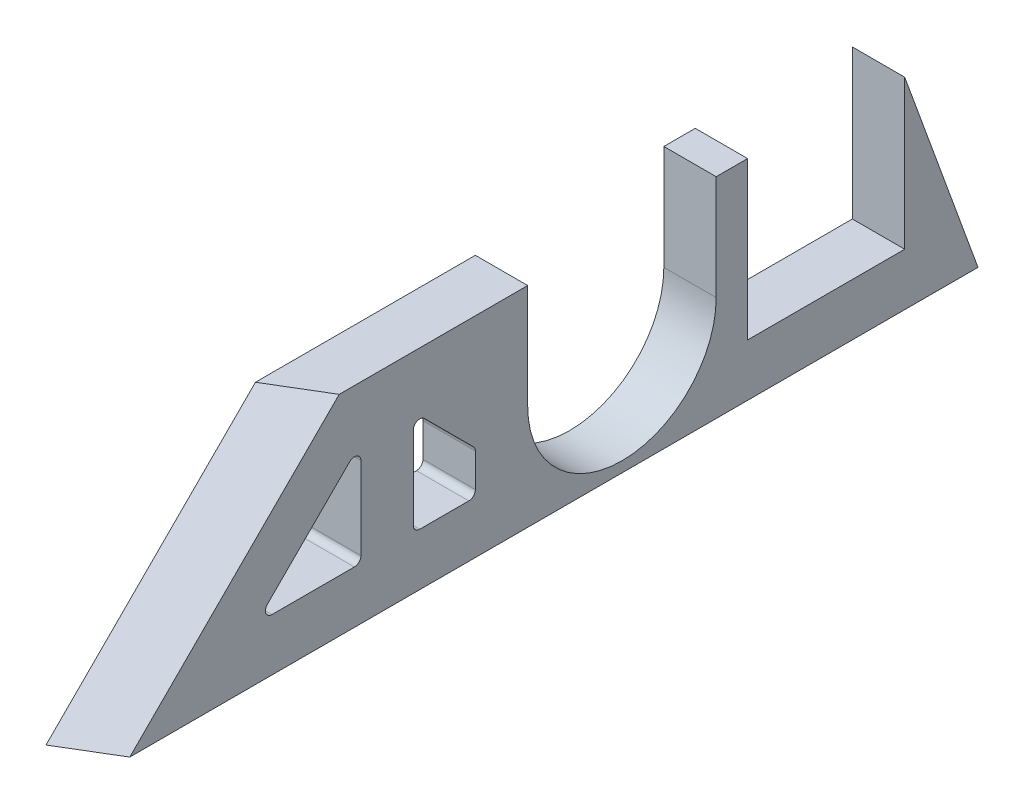
ISO-10303-21;
HEADER;
FILE_DESCRIPTION(('STEP AP214'),'2;1');
FILE_NAME('part.step','',(''),(''),'','','');
FILE_SCHEMA(('AUTOMOTIVE_DESIGN { 1 0 10303 214 1 1 1 1 }'));
ENDSEC;
DATA;
#1=APPLICATION_CONTEXT('core data for automotive mechanical design processes');
#2=APPLICATION_PROTOCOL_DEFINITION('international standard','automotive_design',2000,#1);
#3=PRODUCT_CONTEXT('',#1,'mechanical');
#4=PRODUCT('Part','Part','',(#3));
#5=PRODUCT_RELATED_PRODUCT_CATEGORY('part','',(#4));
#6=PRODUCT_DEFINITION_FORMATION('','',#4);
#7=PRODUCT_DEFINITION_CONTEXT('part definition',#1,'design');
#8=PRODUCT_DEFINITION('design','',#6,#7);
#9=PRODUCT_DEFINITION_SHAPE('','',#8);
#10=(LENGTH_UNIT() NAMED_UNIT(*) SI_UNIT(.MILLI.,.METRE.));
#11=(NAMED_UNIT(*) PLANE_ANGLE_UNIT() SI_UNIT($,.RADIAN.));
#12=(NAMED_UNIT(*) SI_UNIT($,.STERADIAN.) SOLID_ANGLE_UNIT());
#13=UNCERTAINTY_MEASURE_WITH_UNIT(LENGTH_MEASURE(1.E-05),#10,'distance_accuracy_value','');
#14=(GEOMETRIC_REPRESENTATION_CONTEXT(3) GLOBAL_UNCERTAINTY_ASSIGNED_CONTEXT((#13)) GLOBAL_UNIT_ASSIGNED_CONTEXT((#10,
#11,#12)) REPRESENTATION_CONTEXT('',''));
#15=CARTESIAN_POINT('',(0.,0.,0.));
#16=DIRECTION('',(0.,0.,1.));
#17=DIRECTION('',(1.,0.,0.));
#18=AXIS2_PLACEMENT_3D('',#15,#16,#17);
#19=CARTESIAN_POINT('',(12.7,0.,0.));
#20=DIRECTION('',(1.,0.,0.));
#21=DIRECTION('',(0.,0.,-1.));
#22=AXIS2_PLACEMENT_3D('',#19,#20,#21);
#23=PLANE('',#22);
#24=DIRECTION('',(0.,-0.707106781186544,0.707106781186551));
#25=VECTOR('',#24,1.);
#26=CARTESIAN_POINT('',(12.7,128.271,-29.2110000000011));
#27=LINE('',#26,#25);
#28=CARTESIAN_POINT('',(12.7,50.8,48.2599999999995));
#29=VERTEX_POINT('',#28);
#30=CARTESIAN_POINT('',(12.7,0.,99.06));
#31=VERTEX_POINT('',#30);
#32=EDGE_CURVE('E199',#29,#31,#27,.T.);
#33=ORIENTED_EDGE('',*,*,#32,.T.);
#34=DIRECTION('',(0.,0.,-1.));
#35=VECTOR('',#34,1.);
#36=CARTESIAN_POINT('',(12.7,0.,0.));
#37=LINE('',#36,#35);
#38=CARTESIAN_POINT('',(12.7,0.,-106.68));
#39=VERTEX_POINT('',#38);
#40=EDGE_CURVE('E225',#31,#39,#37,.T.);
#41=ORIENTED_EDGE('',*,*,#40,.T.);
#42=DIRECTION('',(0.,0.939692620785907,0.342020143325673));
#43=VECTOR('',#42,1.);
#44=CARTESIAN_POINT('',(12.7,34.2862911006804,-94.200810595966));
#45=LINE('',#44,#43);
#46=CARTESIAN_POINT('',(12.7,48.8501485179025,-88.9));
#47=VERTEX_POINT('',#46);
#48=EDGE_CURVE('E228',#39,#47,#45,.T.);
#49=ORIENTED_EDGE('',*,*,#48,.T.);
#50=DIRECTION('',(0.,-1.,0.));
#51=VECTOR('',#50,1.);
#52=CARTESIAN_POINT('',(12.7,0.,-88.9));
#53=LINE('',#52,#51);
#54=CARTESIAN_POINT('',(12.7,12.7,-88.9));
#55=VERTEX_POINT('',#54);
#56=EDGE_CURVE('E244',#47,#55,#53,.T.);
#57=ORIENTED_EDGE('',*,*,#56,.T.);
#58=DIRECTION('',(0.,0.,1.));
#59=VECTOR('',#58,1.);
#60=CARTESIAN_POINT('',(12.7,12.7,0.));
#61=LINE('',#60,#59);
#62=CARTESIAN_POINT('',(12.7,12.7,-50.8));
#63=VERTEX_POINT('',#62);
#64=EDGE_CURVE('E240',#55,#63,#61,.T.);
#65=ORIENTED_EDGE('',*,*,#64,.T.);
#66=DIRECTION('',(0.,1.,0.));
#67=VECTOR('',#66,1.);
#68=CARTESIAN_POINT('',(12.7,0.,-50.8));
#69=LINE('',#68,#67);
#70=CARTESIAN_POINT('',(12.7,50.8,-50.8));
#71=VERTEX_POINT('',#70);
#72=EDGE_CURVE('E233',#63,#71,#69,.T.);
#73=ORIENTED_EDGE('',*,*,#72,.T.);
#74=DIRECTION('',(0.,0.,1.));
#75=VECTOR('',#74,1.);
#76=CARTESIAN_POINT('',(12.7,50.8,0.));
#77=LINE('',#76,#75);
#78=CARTESIAN_POINT('',(12.7,50.8,-43.18));
#79=VERTEX_POINT('',#78);
#80=EDGE_CURVE('E227',#71,#79,#77,.T.);
#81=ORIENTED_EDGE('',*,*,#80,.T.);
#82=DIRECTION('',(0.,1.,0.));
#83=VECTOR('',#82,1.);
#84=CARTESIAN_POINT('',(12.7,0.,-43.18));
#85=LINE('',#84,#83);
#86=CARTESIAN_POINT('',(12.7,25.4,-43.18));
#87=VERTEX_POINT('',#86);
#88=EDGE_CURVE('E232',#87,#79,#85,.T.);
#89=ORIENTED_EDGE('',*,*,#88,.F.);
#90=CARTESIAN_POINT('',(12.7,25.4,-20.32));
#91=DIRECTION('',(1.,0.,0.));
#92=DIRECTION('',(0.,0.,-1.));
#93=AXIS2_PLACEMENT_3D('',#90,#91,#92);
#94=CIRCLE('',#93,22.86);
#95=CARTESIAN_POINT('',(12.7,25.4,2.54));
#96=VERTEX_POINT('',#95);
#97=EDGE_CURVE('E230',#96,#87,#94,.T.);
#98=ORIENTED_EDGE('',*,*,#97,.F.);
#99=DIRECTION('',(0.,1.,0.));
#100=VECTOR('',#99,1.);
#101=CARTESIAN_POINT('',(12.7,0.,2.54));
#102=LINE('',#101,#100);
#103=CARTESIAN_POINT('',(12.7,50.8,2.54));
#104=VERTEX_POINT('',#103);
#105=EDGE_CURVE('E223',#96,#104,#102,.T.);
#106=ORIENTED_EDGE('',*,*,#105,.T.);
#107=EDGE_CURVE('E215',#104,#29,#77,.T.);
#108=ORIENTED_EDGE('',*,*,#107,.T.);
#109=EDGE_LOOP('',(#33,#41,#49,#57,#65,#73,#81,#89,#98,#106,#108));
#110=FACE_BOUND('',#109,.T.);
#111=DIRECTION('',(0.,0.707106781186547,0.707106781186548));
#112=VECTOR('',#111,1.);
#113=CARTESIAN_POINT('',(12.7,3.90025612106941,-3.90025612106941));
#114=LINE('',#113,#112);
#115=CARTESIAN_POINT('',(12.7,23.5054802270052,15.7049679848664));
#116=VERTEX_POINT('',#115);
#117=CARTESIAN_POINT('',(12.7,35.3899679848664,27.5894557427275));
#118=VERTEX_POINT('',#117);
#119=EDGE_CURVE('E351',#116,#118,#114,.T.);
#120=ORIENTED_EDGE('',*,*,#119,.F.);
#121=CARTESIAN_POINT('',(12.7,22.3829482118715,16.8275));
#122=DIRECTION('',(1.,0.,0.));
#123=DIRECTION('',(0.,0.,-1.));
#124=AXIS2_PLACEMENT_3D('',#121,#122,#123);
#125=CIRCLE('',#124,1.5875);
#126=CARTESIAN_POINT('',(12.7,22.3829482118715,15.24));
#127=VERTEX_POINT('',#126);
#128=EDGE_CURVE('E41',#116,#127,#125,.F.);
#129=ORIENTED_EDGE('',*,*,#128,.T.);
#130=DIRECTION('',(0.,-1.,0.));
#131=VECTOR('',#130,1.);
#132=CARTESIAN_POINT('',(12.7,0.,15.24));
#133=LINE('',#132,#131);
#134=CARTESIAN_POINT('',(12.7,14.2875,15.24));
#135=VERTEX_POINT('',#134);
#136=EDGE_CURVE('E350',#127,#135,#133,.T.);
#137=ORIENTED_EDGE('',*,*,#136,.T.);
#138=CARTESIAN_POINT('',(12.7,14.2875,16.8275));
#139=DIRECTION('',(1.,0.,0.));
#140=DIRECTION('',(0.,0.,-1.));
#141=AXIS2_PLACEMENT_3D('',#138,#139,#140);
#142=CIRCLE('',#141,1.5875);
#143=CARTESIAN_POINT('',(12.7,12.7,16.8275));
#144=VERTEX_POINT('',#143);
#145=EDGE_CURVE('E337',#135,#144,#142,.F.);
#146=ORIENTED_EDGE('',*,*,#145,.T.);
#147=DIRECTION('',(0.,0.,-1.));
#148=VECTOR('',#147,1.);
#149=CARTESIAN_POINT('',(12.7,12.7,0.));
#150=LINE('',#149,#148);
#151=CARTESIAN_POINT('',(12.7,12.7,28.7119877578612));
#152=VERTEX_POINT('',#151);
#153=EDGE_CURVE('E372',#152,#144,#150,.T.);
#154=ORIENTED_EDGE('',*,*,#153,.F.);
#155=CARTESIAN_POINT('',(12.7,14.2875,28.7119877578612));
#156=DIRECTION('',(1.,0.,0.));
#157=DIRECTION('',(0.,0.,-1.));
#158=AXIS2_PLACEMENT_3D('',#155,#156,#157);
#159=CIRCLE('',#158,1.5875);
#160=CARTESIAN_POINT('',(12.7,14.2875,30.2994877578612));
#161=VERTEX_POINT('',#160);
#162=EDGE_CURVE('E329',#152,#161,#159,.F.);
#163=ORIENTED_EDGE('',*,*,#162,.T.);
#164=DIRECTION('',(0.,-1.,0.));
#165=VECTOR('',#164,1.);
#166=CARTESIAN_POINT('',(12.7,0.,30.2994877578612));
#167=LINE('',#166,#165);
#168=CARTESIAN_POINT('',(12.7,34.2674359697327,30.2994877578612));
#169=VERTEX_POINT('',#168);
#170=EDGE_CURVE('E378',#169,#161,#167,.T.);
#171=ORIENTED_EDGE('',*,*,#170,.F.);
#172=CARTESIAN_POINT('',(12.7,34.2674359697327,28.7119877578612));
#173=DIRECTION('',(1.,0.,0.));
#174=DIRECTION('',(0.,0.,-1.));
#175=AXIS2_PLACEMENT_3D('',#172,#173,#174);
#176=CIRCLE('',#175,1.5875);
#177=EDGE_CURVE('E48',#169,#118,#176,.F.);
#178=ORIENTED_EDGE('',*,*,#177,.T.);
#179=EDGE_LOOP('',(#120,#129,#137,#146,#154,#163,#171,#178));
#180=FACE_BOUND('',#179,.T.);
#181=DIRECTION('',(0.,0.707106781186547,-0.707106781186548));
#182=VECTOR('',#181,1.);
#183=CARTESIAN_POINT('',(12.7,40.5497438789306,40.5497438789306));
#184=LINE('',#183,#182);
#185=CARTESIAN_POINT('',(12.7,15.4100320151336,65.6894557427275));
#186=VERTEX_POINT('',#185);
#187=CARTESIAN_POINT('',(12.7,35.3899679848664,45.7095197729948));
#188=VERTEX_POINT('',#187);
#189=EDGE_CURVE('E676',#186,#188,#184,.T.);
#190=ORIENTED_EDGE('',*,*,#189,.T.);
#191=CARTESIAN_POINT('',(12.7,34.2674359697327,44.5869877578612));
#192=DIRECTION('',(1.,0.,0.));
#193=DIRECTION('',(0.,0.,-1.));
#194=AXIS2_PLACEMENT_3D('',#191,#192,#193);
#195=CIRCLE('',#194,1.5875);
#196=CARTESIAN_POINT('',(12.7,34.2674359697327,42.9994877578612));
#197=VERTEX_POINT('',#196);
#198=EDGE_CURVE('E341',#188,#197,#195,.F.);
#199=ORIENTED_EDGE('',*,*,#198,.T.);
#200=DIRECTION('',(0.,-1.,0.));
#201=VECTOR('',#200,1.);
#202=CARTESIAN_POINT('',(12.7,0.,42.9994877578612));
#203=LINE('',#202,#201);
#204=CARTESIAN_POINT('',(12.7,14.2875,42.9994877578612));
#205=VERTEX_POINT('',#204);
#206=EDGE_CURVE('E679',#197,#205,#203,.T.);
#207=ORIENTED_EDGE('',*,*,#206,.T.);
#208=CARTESIAN_POINT('',(12.7,14.2875,44.5869877578612));
#209=DIRECTION('',(1.,0.,0.));
#210=DIRECTION('',(0.,0.,-1.));
#211=AXIS2_PLACEMENT_3D('',#208,#209,#210);
#212=CIRCLE('',#211,1.5875);
#213=CARTESIAN_POINT('',(12.7,12.7,44.5869877578612));
#214=VERTEX_POINT('',#213);
#215=EDGE_CURVE('E333',#205,#214,#212,.F.);
#216=ORIENTED_EDGE('',*,*,#215,.T.);
#217=DIRECTION('',(0.,0.,1.));
#218=VECTOR('',#217,1.);
#219=CARTESIAN_POINT('',(12.7,12.7,0.));
#220=LINE('',#219,#218);
#221=CARTESIAN_POINT('',(12.7,12.7,64.5669237275939));
#222=VERTEX_POINT('',#221);
#223=EDGE_CURVE('E682',#214,#222,#220,.T.);
#224=ORIENTED_EDGE('',*,*,#223,.T.);
#225=CARTESIAN_POINT('',(12.7,14.2875,64.5669237275939));
#226=DIRECTION('',(1.,0.,0.));
#227=DIRECTION('',(0.,0.,-1.));
#228=AXIS2_PLACEMENT_3D('',#225,#226,#227);
#229=CIRCLE('',#228,1.5875);
#230=EDGE_CURVE('E325',#222,#186,#229,.F.);
#231=ORIENTED_EDGE('',*,*,#230,.T.);
#232=EDGE_LOOP('',(#190,#199,#207,#216,#224,#231));
#233=FACE_BOUND('',#232,.T.);
#234=ADVANCED_FACE('F33',(#110,#180,#233),#23,.T.);
#235=CARTESIAN_POINT('',(0.,0.,0.));
#236=DIRECTION('',(1.,0.,0.));
#237=DIRECTION('',(0.,0.,-1.));
#238=AXIS2_PLACEMENT_3D('',#235,#236,#237);
#239=PLANE('',#238);
#240=DIRECTION('',(0.,0.,1.));
#241=VECTOR('',#240,1.);
#242=CARTESIAN_POINT('',(0.,12.7,0.));
#243=LINE('',#242,#241);
#244=CARTESIAN_POINT('',(0.,12.7,16.8275));
#245=VERTEX_POINT('',#244);
#246=CARTESIAN_POINT('',(0.,12.7,28.7119877578612));
#247=VERTEX_POINT('',#246);
#248=EDGE_CURVE('E663',#245,#247,#243,.T.);
#249=ORIENTED_EDGE('',*,*,#248,.F.);
#250=CARTESIAN_POINT('',(0.,14.2875,16.8275));
#251=DIRECTION('',(1.,0.,0.));
#252=DIRECTION('',(0.,0.,-1.));
#253=AXIS2_PLACEMENT_3D('',#250,#251,#252);
#254=CIRCLE('',#253,1.5875);
#255=CARTESIAN_POINT('',(0.,14.2875,15.24));
#256=VERTEX_POINT('',#255);
#257=EDGE_CURVE('E339',#245,#256,#254,.T.);
#258=ORIENTED_EDGE('',*,*,#257,.T.);
#259=DIRECTION('',(0.,1.,0.));
#260=VECTOR('',#259,1.);
#261=CARTESIAN_POINT('',(0.,0.,15.24));
#262=LINE('',#261,#260);
#263=CARTESIAN_POINT('',(0.,22.3829482118715,15.24));
#264=VERTEX_POINT('',#263);
#265=EDGE_CURVE('E357',#256,#264,#262,.T.);
#266=ORIENTED_EDGE('',*,*,#265,.T.);
#267=CARTESIAN_POINT('',(0.,22.3829482118715,16.8275));
#268=DIRECTION('',(1.,0.,0.));
#269=DIRECTION('',(0.,0.,-1.));
#270=AXIS2_PLACEMENT_3D('',#267,#268,#269);
#271=CIRCLE('',#270,1.5875);
#272=CARTESIAN_POINT('',(0.,23.5054802270052,15.7049679848663));
#273=VERTEX_POINT('',#272);
#274=EDGE_CURVE('E11',#264,#273,#271,.T.);
#275=ORIENTED_EDGE('',*,*,#274,.T.);
#276=DIRECTION('',(0.,-0.707106781186547,-0.707106781186548));
#277=VECTOR('',#276,1.);
#278=CARTESIAN_POINT('',(0.,3.90025612106941,-3.90025612106941));
#279=LINE('',#278,#277);
#280=CARTESIAN_POINT('',(0.,35.3899679848664,27.5894557427275));
#281=VERTEX_POINT('',#280);
#282=EDGE_CURVE('E366',#281,#273,#279,.T.);
#283=ORIENTED_EDGE('',*,*,#282,.F.);
#284=CARTESIAN_POINT('',(0.,34.2674359697327,28.7119877578612));
#285=DIRECTION('',(1.,0.,0.));
#286=DIRECTION('',(0.,0.,-1.));
#287=AXIS2_PLACEMENT_3D('',#284,#285,#286);
#288=CIRCLE('',#287,1.5875);
#289=CARTESIAN_POINT('',(0.,34.2674359697327,30.2994877578612));
#290=VERTEX_POINT('',#289);
#291=EDGE_CURVE('E346',#281,#290,#288,.T.);
#292=ORIENTED_EDGE('',*,*,#291,.T.);
#293=DIRECTION('',(0.,1.,0.));
#294=VECTOR('',#293,1.);
#295=CARTESIAN_POINT('',(0.,0.,30.2994877578612));
#296=LINE('',#295,#294);
#297=CARTESIAN_POINT('',(0.,14.2875,30.2994877578612));
#298=VERTEX_POINT('',#297);
#299=EDGE_CURVE('E659',#298,#290,#296,.T.);
#300=ORIENTED_EDGE('',*,*,#299,.F.);
#301=CARTESIAN_POINT('',(0.,14.2875,28.7119877578612));
#302=DIRECTION('',(1.,0.,0.));
#303=DIRECTION('',(0.,0.,-1.));
#304=AXIS2_PLACEMENT_3D('',#301,#302,#303);
#305=CIRCLE('',#304,1.5875);
#306=EDGE_CURVE('E331',#298,#247,#305,.T.);
#307=ORIENTED_EDGE('',*,*,#306,.T.);
#308=EDGE_LOOP('',(#249,#258,#266,#275,#283,#292,#300,#307));
#309=FACE_BOUND('',#308,.T.);
#310=CARTESIAN_POINT('',(0.,25.4,-20.32));
#311=DIRECTION('',(1.,0.,0.));
#312=DIRECTION('',(0.,0.,-1.));
#313=AXIS2_PLACEMENT_3D('',#310,#311,#312);
#314=CIRCLE('',#313,22.86);
#315=CARTESIAN_POINT('',(0.,25.4,2.54));
#316=VERTEX_POINT('',#315);
#317=CARTESIAN_POINT('',(0.,25.4,-43.18));
#318=VERTEX_POINT('',#317);
#319=EDGE_CURVE('E209',#316,#318,#314,.T.);
#320=ORIENTED_EDGE('',*,*,#319,.T.);
#321=DIRECTION('',(0.,1.,0.));
#322=VECTOR('',#321,1.);
#323=CARTESIAN_POINT('',(0.,0.,-43.18));
#324=LINE('',#323,#322);
#325=CARTESIAN_POINT('',(0.,50.8,-43.18));
#326=VERTEX_POINT('',#325);
#327=EDGE_CURVE('E266',#318,#326,#324,.T.);
#328=ORIENTED_EDGE('',*,*,#327,.T.);
#329=DIRECTION('',(0.,0.,1.));
#330=VECTOR('',#329,1.);
#331=CARTESIAN_POINT('',(0.,50.8,0.));
#332=LINE('',#331,#330);
#333=CARTESIAN_POINT('',(0.,50.8,-50.8));
#334=VERTEX_POINT('',#333);
#335=EDGE_CURVE('E254',#334,#326,#332,.T.);
#336=ORIENTED_EDGE('',*,*,#335,.F.);
#337=DIRECTION('',(0.,1.,0.));
#338=VECTOR('',#337,1.);
#339=CARTESIAN_POINT('',(0.,0.,-50.8));
#340=LINE('',#339,#338);
#341=CARTESIAN_POINT('',(0.,12.7,-50.8));
#342=VERTEX_POINT('',#341);
#343=EDGE_CURVE('E264',#342,#334,#340,.T.);
#344=ORIENTED_EDGE('',*,*,#343,.F.);
#345=DIRECTION('',(0.,0.,1.));
#346=VECTOR('',#345,1.);
#347=CARTESIAN_POINT('',(0.,12.7,0.));
#348=LINE('',#347,#346);
#349=CARTESIAN_POINT('',(0.,12.7,-88.9));
#350=VERTEX_POINT('',#349);
#351=EDGE_CURVE('E262',#350,#342,#348,.T.);
#352=ORIENTED_EDGE('',*,*,#351,.F.);
#353=DIRECTION('',(0.,-1.,0.));
#354=VECTOR('',#353,1.);
#355=CARTESIAN_POINT('',(0.,0.,-88.9));
#356=LINE('',#355,#354);
#357=CARTESIAN_POINT('',(0.,48.8501485179025,-88.9));
#358=VERTEX_POINT('',#357);
#359=EDGE_CURVE('E260',#358,#350,#356,.T.);
#360=ORIENTED_EDGE('',*,*,#359,.F.);
#361=DIRECTION('',(0.,0.939692620785907,0.342020143325673));
#362=VECTOR('',#361,1.);
#363=CARTESIAN_POINT('',(0.,34.2862911006804,-94.200810595966));
#364=LINE('',#363,#362);
#365=CARTESIAN_POINT('',(0.,0.,-106.68));
#366=VERTEX_POINT('',#365);
#367=EDGE_CURVE('E258',#366,#358,#364,.T.);
#368=ORIENTED_EDGE('',*,*,#367,.F.);
#369=DIRECTION('',(0.,0.,-1.));
#370=VECTOR('',#369,1.);
#371=CARTESIAN_POINT('',(0.,0.,0.));
#372=LINE('',#371,#370);
#373=CARTESIAN_POINT('',(0.,0.,106.68));
#374=VERTEX_POINT('',#373);
#375=EDGE_CURVE('E256',#374,#366,#372,.T.);
#376=ORIENTED_EDGE('',*,*,#375,.F.);
#377=DIRECTION('',(0.,-0.707106781186544,0.707106781186551));
#378=VECTOR('',#377,1.);
#379=CARTESIAN_POINT('',(0.,53.34,53.3399999999994));
#380=LINE('',#379,#378);
#381=CARTESIAN_POINT('',(0.,50.8,55.8799999999995));
#382=VERTEX_POINT('',#381);
#383=EDGE_CURVE('E253',#382,#374,#380,.T.);
#384=ORIENTED_EDGE('',*,*,#383,.F.);
#385=CARTESIAN_POINT('',(0.,50.8,2.54));
#386=VERTEX_POINT('',#385);
#387=EDGE_CURVE('E217',#386,#382,#332,.T.);
#388=ORIENTED_EDGE('',*,*,#387,.F.);
#389=DIRECTION('',(0.,1.,0.));
#390=VECTOR('',#389,1.);
#391=CARTESIAN_POINT('',(0.,0.,2.54));
#392=LINE('',#391,#390);
#393=EDGE_CURVE('E250',#316,#386,#392,.T.);
#394=ORIENTED_EDGE('',*,*,#393,.F.);
#395=EDGE_LOOP('',(#320,#328,#336,#344,#352,#360,#368,#376,#384,#388,#394));
#396=FACE_BOUND('',#395,.T.);
#397=DIRECTION('',(0.,-0.707106781186548,0.707106781186548));
#398=VECTOR('',#397,1.);
#399=CARTESIAN_POINT('',(0.,40.5497438789306,40.5497438789306));
#400=LINE('',#399,#398);
#401=CARTESIAN_POINT('',(0.,35.3899679848664,45.7095197729948));
#402=VERTEX_POINT('',#401);
#403=CARTESIAN_POINT('',(0.,15.4100320151336,65.6894557427275));
#404=VERTEX_POINT('',#403);
#405=EDGE_CURVE('E371',#402,#404,#400,.T.);
#406=ORIENTED_EDGE('',*,*,#405,.T.);
#407=CARTESIAN_POINT('',(0.,14.2875,64.5669237275939));
#408=DIRECTION('',(1.,0.,0.));
#409=DIRECTION('',(0.,0.,-1.));
#410=AXIS2_PLACEMENT_3D('',#407,#408,#409);
#411=CIRCLE('',#410,1.5875);
#412=CARTESIAN_POINT('',(0.,12.7,64.5669237275939));
#413=VERTEX_POINT('',#412);
#414=EDGE_CURVE('E327',#404,#413,#411,.T.);
#415=ORIENTED_EDGE('',*,*,#414,.T.);
#416=DIRECTION('',(0.,0.,-1.));
#417=VECTOR('',#416,1.);
#418=CARTESIAN_POINT('',(0.,12.7,0.));
#419=LINE('',#418,#417);
#420=CARTESIAN_POINT('',(0.,12.7,44.5869877578612));
#421=VERTEX_POINT('',#420);
#422=EDGE_CURVE('E375',#413,#421,#419,.T.);
#423=ORIENTED_EDGE('',*,*,#422,.T.);
#424=CARTESIAN_POINT('',(0.,14.2875,44.5869877578612));
#425=DIRECTION('',(1.,0.,0.));
#426=DIRECTION('',(0.,0.,-1.));
#427=AXIS2_PLACEMENT_3D('',#424,#425,#426);
#428=CIRCLE('',#427,1.5875);
#429=CARTESIAN_POINT('',(0.,14.2875,42.9994877578612));
#430=VERTEX_POINT('',#429);
#431=EDGE_CURVE('E335',#421,#430,#428,.T.);
#432=ORIENTED_EDGE('',*,*,#431,.T.);
#433=DIRECTION('',(0.,1.,0.));
#434=VECTOR('',#433,1.);
#435=CARTESIAN_POINT('',(0.,0.,42.9994877578612));
#436=LINE('',#435,#434);
#437=CARTESIAN_POINT('',(0.,34.2674359697327,42.9994877578612));
#438=VERTEX_POINT('',#437);
#439=EDGE_CURVE('E219',#430,#438,#436,.T.);
#440=ORIENTED_EDGE('',*,*,#439,.T.);
#441=CARTESIAN_POINT('',(0.,34.2674359697327,44.5869877578612));
#442=DIRECTION('',(1.,0.,0.));
#443=DIRECTION('',(0.,0.,-1.));
#444=AXIS2_PLACEMENT_3D('',#441,#442,#443);
#445=CIRCLE('',#444,1.5875);
#446=EDGE_CURVE('E343',#438,#402,#445,.T.);
#447=ORIENTED_EDGE('',*,*,#446,.T.);
#448=EDGE_LOOP('',(#406,#415,#423,#432,#440,#447));
#449=FACE_BOUND('',#448,.T.);
#450=ADVANCED_FACE('F364',(#309,#396,#449),#239,.F.);
#451=CARTESIAN_POINT('',(12.7,25.4,-20.32));
#452=DIRECTION('',(-1.,0.,0.));
#453=DIRECTION('',(0.,0.,1.));
#454=AXIS2_PLACEMENT_3D('',#451,#452,#453);
#455=CYLINDRICAL_SURFACE('',#454,22.86);
#456=ORIENTED_EDGE('',*,*,#319,.F.);
#457=DIRECTION('',(-1.,0.,0.));
#458=VECTOR('',#457,1.);
#459=CARTESIAN_POINT('',(12.7,25.4,2.54));
#460=LINE('',#459,#458);
#461=EDGE_CURVE('E289',#96,#316,#460,.T.);
#462=ORIENTED_EDGE('',*,*,#461,.F.);
#463=ORIENTED_EDGE('',*,*,#97,.T.);
#464=DIRECTION('',(-1.,0.,0.));
#465=VECTOR('',#464,1.);
#466=CARTESIAN_POINT('',(12.7,25.4,-43.18));
#467=LINE('',#466,#465);
#468=EDGE_CURVE('E238',#87,#318,#467,.T.);
#469=ORIENTED_EDGE('',*,*,#468,.T.);
#470=EDGE_LOOP('',(#456,#462,#463,#469));
#471=FACE_BOUND('',#470,.T.);
#472=ADVANCED_FACE('F386',(#471),#455,.F.);
#473=CARTESIAN_POINT('',(12.7,0.,2.54));
#474=DIRECTION('',(0.,0.,1.));
#475=DIRECTION('',(1.,0.,0.));
#476=AXIS2_PLACEMENT_3D('',#473,#474,#475);
#477=PLANE('',#476);
#478=ORIENTED_EDGE('',*,*,#393,.T.);
#479=DIRECTION('',(-1.,0.,0.));
#480=VECTOR('',#479,1.);
#481=CARTESIAN_POINT('',(12.7,50.8,2.54));
#482=LINE('',#481,#480);
#483=EDGE_CURVE('E287',#104,#386,#482,.T.);
#484=ORIENTED_EDGE('',*,*,#483,.F.);
#485=ORIENTED_EDGE('',*,*,#105,.F.);
#486=ORIENTED_EDGE('',*,*,#461,.T.);
#487=EDGE_LOOP('',(#478,#484,#485,#486));
#488=FACE_BOUND('',#487,.T.);
#489=ADVANCED_FACE('F396',(#488),#477,.F.);
#490=CARTESIAN_POINT('',(12.7,50.8,0.));
#491=DIRECTION('',(0.,-1.,0.));
#492=DIRECTION('',(0.,0.,-1.));
#493=AXIS2_PLACEMENT_3D('',#490,#491,#492);
#494=PLANE('',#493);
#495=ORIENTED_EDGE('',*,*,#387,.T.);
#496=DIRECTION('',(-0.857492925712544,0.,0.514495755427527));
#497=VECTOR('',#496,1.);
#498=CARTESIAN_POINT('',(46.8783823529414,50.8,27.7529705882346));
#499=LINE('',#498,#497);
#500=EDGE_CURVE('E202',#29,#382,#499,.T.);
#501=ORIENTED_EDGE('',*,*,#500,.F.);
#502=ORIENTED_EDGE('',*,*,#107,.F.);
#503=ORIENTED_EDGE('',*,*,#483,.T.);
#504=EDGE_LOOP('',(#495,#501,#502,#503));
#505=FACE_BOUND('',#504,.T.);
#506=ADVANCED_FACE('F213',(#505),#494,.F.);
#507=CARTESIAN_POINT('',(12.7,0.,0.));
#508=DIRECTION('',(0.,1.,0.));
#509=DIRECTION('',(0.,0.,1.));
#510=AXIS2_PLACEMENT_3D('',#507,#508,#509);
#511=PLANE('',#510);
#512=ORIENTED_EDGE('',*,*,#40,.F.);
#513=DIRECTION('',(0.857492925712544,0.,-0.514495755427527));
#514=VECTOR('',#513,1.);
#515=CARTESIAN_POINT('',(12.7,0.,99.06));
#516=LINE('',#515,#514);
#517=EDGE_CURVE('E205',#374,#31,#516,.T.);
#518=ORIENTED_EDGE('',*,*,#517,.F.);
#519=ORIENTED_EDGE('',*,*,#375,.T.);
#520=DIRECTION('',(-1.,0.,0.));
#521=VECTOR('',#520,1.);
#522=CARTESIAN_POINT('',(12.7,0.,-106.68));
#523=LINE('',#522,#521);
#524=EDGE_CURVE('E284',#39,#366,#523,.T.);
#525=ORIENTED_EDGE('',*,*,#524,.F.);
#526=EDGE_LOOP('',(#512,#518,#519,#525));
#527=FACE_BOUND('',#526,.T.);
#528=ADVANCED_FACE('F403',(#527),#511,.F.);
#529=CARTESIAN_POINT('',(12.7,34.2862911006804,-94.200810595966));
#530=DIRECTION('',(0.,-0.342020143325673,0.939692620785907));
#531=DIRECTION('',(0.,-0.939692620785907,-0.342020143325673));
#532=AXIS2_PLACEMENT_3D('',#529,#530,#531);
#533=PLANE('',#532);
#534=ORIENTED_EDGE('',*,*,#367,.T.);
#535=DIRECTION('',(-1.,0.,0.));
#536=VECTOR('',#535,1.);
#537=CARTESIAN_POINT('',(12.7,48.8501485179025,-88.9));
#538=LINE('',#537,#536);
#539=EDGE_CURVE('E281',#47,#358,#538,.T.);
#540=ORIENTED_EDGE('',*,*,#539,.F.);
#541=ORIENTED_EDGE('',*,*,#48,.F.);
#542=ORIENTED_EDGE('',*,*,#524,.T.);
#543=EDGE_LOOP('',(#534,#540,#541,#542));
#544=FACE_BOUND('',#543,.T.);
#545=ADVANCED_FACE('F432',(#544),#533,.F.);
#546=CARTESIAN_POINT('',(12.7,0.,-88.9));
#547=DIRECTION('',(0.,0.,-1.));
#548=DIRECTION('',(0.,1.,0.));
#549=AXIS2_PLACEMENT_3D('',#546,#547,#548);
#550=PLANE('',#549);
#551=ORIENTED_EDGE('',*,*,#359,.T.);
#552=DIRECTION('',(-1.,0.,0.));
#553=VECTOR('',#552,1.);
#554=CARTESIAN_POINT('',(12.7,12.7,-88.9));
#555=LINE('',#554,#553);
#556=EDGE_CURVE('E278',#55,#350,#555,.T.);
#557=ORIENTED_EDGE('',*,*,#556,.F.);
#558=ORIENTED_EDGE('',*,*,#56,.F.);
#559=ORIENTED_EDGE('',*,*,#539,.T.);
#560=EDGE_LOOP('',(#551,#557,#558,#559));
#561=FACE_BOUND('',#560,.T.);
#562=ADVANCED_FACE('F428',(#561),#550,.F.);
#563=CARTESIAN_POINT('',(12.7,12.7,0.));
#564=DIRECTION('',(0.,-1.,0.));
#565=DIRECTION('',(0.,0.,-1.));
#566=AXIS2_PLACEMENT_3D('',#563,#564,#565);
#567=PLANE('',#566);
#568=ORIENTED_EDGE('',*,*,#351,.T.);
#569=DIRECTION('',(-1.,0.,0.));
#570=VECTOR('',#569,1.);
#571=CARTESIAN_POINT('',(12.7,12.7,-50.8));
#572=LINE('',#571,#570);
#573=EDGE_CURVE('E275',#63,#342,#572,.T.);
#574=ORIENTED_EDGE('',*,*,#573,.F.);
#575=ORIENTED_EDGE('',*,*,#64,.F.);
#576=ORIENTED_EDGE('',*,*,#556,.T.);
#577=EDGE_LOOP('',(#568,#574,#575,#576));
#578=FACE_BOUND('',#577,.T.);
#579=ADVANCED_FACE('F424',(#578),#567,.F.);
#580=CARTESIAN_POINT('',(12.7,0.,-50.8));
#581=DIRECTION('',(0.,0.,1.));
#582=DIRECTION('',(1.,0.,0.));
#583=AXIS2_PLACEMENT_3D('',#580,#581,#582);
#584=PLANE('',#583);
#585=ORIENTED_EDGE('',*,*,#343,.T.);
#586=DIRECTION('',(-1.,0.,0.));
#587=VECTOR('',#586,1.);
#588=CARTESIAN_POINT('',(12.7,50.8,-50.8));
#589=LINE('',#588,#587);
#590=EDGE_CURVE('E272',#71,#334,#589,.T.);
#591=ORIENTED_EDGE('',*,*,#590,.F.);
#592=ORIENTED_EDGE('',*,*,#72,.F.);
#593=ORIENTED_EDGE('',*,*,#573,.T.);
#594=EDGE_LOOP('',(#585,#591,#592,#593));
#595=FACE_BOUND('',#594,.T.);
#596=ADVANCED_FACE('F420',(#595),#584,.F.);
#597=ORIENTED_EDGE('',*,*,#335,.T.);
#598=DIRECTION('',(-1.,0.,0.));
#599=VECTOR('',#598,1.);
#600=CARTESIAN_POINT('',(12.7,50.8,-43.18));
#601=LINE('',#600,#599);
#602=EDGE_CURVE('E270',#79,#326,#601,.T.);
#603=ORIENTED_EDGE('',*,*,#602,.F.);
#604=ORIENTED_EDGE('',*,*,#80,.F.);
#605=ORIENTED_EDGE('',*,*,#590,.T.);
#606=EDGE_LOOP('',(#597,#603,#604,#605));
#607=FACE_BOUND('',#606,.T.);
#608=ADVANCED_FACE('F405',(#607),#494,.F.);
#609=CARTESIAN_POINT('',(12.7,0.,-43.18));
#610=DIRECTION('',(0.,0.,1.));
#611=DIRECTION('',(0.,-1.,0.));
#612=AXIS2_PLACEMENT_3D('',#609,#610,#611);
#613=PLANE('',#612);
#614=ORIENTED_EDGE('',*,*,#327,.F.);
#615=ORIENTED_EDGE('',*,*,#468,.F.);
#616=ORIENTED_EDGE('',*,*,#88,.T.);
#617=ORIENTED_EDGE('',*,*,#602,.T.);
#618=EDGE_LOOP('',(#614,#615,#616,#617));
#619=FACE_BOUND('',#618,.T.);
#620=ADVANCED_FACE('F389',(#619),#613,.T.);
#621=CARTESIAN_POINT('',(12.7,128.271,-29.2110000000011));
#622=DIRECTION('',(-0.39056673294247,-0.650944554904123,-0.650944554904117));
#623=DIRECTION('',(0.,0.707106781186544,-0.707106781186551));
#624=AXIS2_PLACEMENT_3D('',#621,#622,#623);
#625=PLANE('',#624);
#626=ORIENTED_EDGE('',*,*,#500,.T.);
#627=ORIENTED_EDGE('',*,*,#383,.T.);
#628=ORIENTED_EDGE('',*,*,#517,.T.);
#629=ORIENTED_EDGE('',*,*,#32,.F.);
#630=EDGE_LOOP('',(#626,#627,#628,#629));
#631=FACE_BOUND('',#630,.T.);
#632=ADVANCED_FACE('F201',(#631),#625,.F.);
#633=CARTESIAN_POINT('',(-0.000999999999999265,0.,15.24));
#634=DIRECTION('',(0.,0.,1.));
#635=DIRECTION('',(0.,-1.,0.));
#636=AXIS2_PLACEMENT_3D('',#633,#634,#635);
#637=PLANE('',#636);
#638=ORIENTED_EDGE('',*,*,#265,.F.);
#639=DIRECTION('',(1.,0.,0.));
#640=VECTOR('',#639,1.);
#641=CARTESIAN_POINT('',(-0.000999999999999265,14.2875,15.24));
#642=LINE('',#641,#640);
#643=EDGE_CURVE('E318',#256,#135,#642,.T.);
#644=ORIENTED_EDGE('',*,*,#643,.T.);
#645=ORIENTED_EDGE('',*,*,#136,.F.);
#646=DIRECTION('',(1.,0.,0.));
#647=VECTOR('',#646,1.);
#648=CARTESIAN_POINT('',(-0.000999999999999265,22.3829482118715,15.24));
#649=LINE('',#648,#647);
#650=EDGE_CURVE('E316',#127,#264,#649,.F.);
#651=ORIENTED_EDGE('',*,*,#650,.T.);
#652=EDGE_LOOP('',(#638,#644,#645,#651));
#653=FACE_BOUND('',#652,.T.);
#654=ADVANCED_FACE('F354',(#653),#637,.T.);
#655=CARTESIAN_POINT('',(-0.000999999999999265,12.7,0.));
#656=DIRECTION('',(0.,-1.,0.));
#657=DIRECTION('',(0.,0.,-1.));
#658=AXIS2_PLACEMENT_3D('',#655,#656,#657);
#659=PLANE('',#658);
#660=ORIENTED_EDGE('',*,*,#248,.T.);
#661=DIRECTION('',(1.,0.,0.));
#662=VECTOR('',#661,1.);
#663=CARTESIAN_POINT('',(12.7,12.7,28.7119877578612));
#664=LINE('',#663,#662);
#665=EDGE_CURVE('E303',#247,#152,#664,.T.);
#666=ORIENTED_EDGE('',*,*,#665,.T.);
#667=ORIENTED_EDGE('',*,*,#153,.T.);
#668=DIRECTION('',(1.,0.,0.));
#669=VECTOR('',#668,1.);
#670=CARTESIAN_POINT('',(-0.000999999999999265,12.7,16.8275));
#671=LINE('',#670,#669);
#672=EDGE_CURVE('E301',#144,#245,#671,.F.);
#673=ORIENTED_EDGE('',*,*,#672,.T.);
#674=EDGE_LOOP('',(#660,#666,#667,#673));
#675=FACE_BOUND('',#674,.T.);
#676=ADVANCED_FACE('F489',(#675),#659,.F.);
#677=CARTESIAN_POINT('',(-0.000999999999999265,0.,30.2994877578612));
#678=DIRECTION('',(0.,0.,1.));
#679=DIRECTION('',(0.,-1.,0.));
#680=AXIS2_PLACEMENT_3D('',#677,#678,#679);
#681=PLANE('',#680);
#682=ORIENTED_EDGE('',*,*,#170,.T.);
#683=DIRECTION('',(1.,0.,0.));
#684=VECTOR('',#683,1.);
#685=CARTESIAN_POINT('',(0.,14.2875,30.2994877578612));
#686=LINE('',#685,#684);
#687=EDGE_CURVE('E309',#161,#298,#686,.F.);
#688=ORIENTED_EDGE('',*,*,#687,.T.);
#689=ORIENTED_EDGE('',*,*,#299,.T.);
#690=DIRECTION('',(1.,0.,0.));
#691=VECTOR('',#690,1.);
#692=CARTESIAN_POINT('',(12.7,34.2674359697327,30.2994877578612));
#693=LINE('',#692,#691);
#694=EDGE_CURVE('E306',#290,#169,#693,.T.);
#695=ORIENTED_EDGE('',*,*,#694,.T.);
#696=EDGE_LOOP('',(#682,#688,#689,#695));
#697=FACE_BOUND('',#696,.T.);
#698=ADVANCED_FACE('F496',(#697),#681,.F.);
#699=CARTESIAN_POINT('',(-0.000999999999999265,3.90025612106941,-3.90025612106941));
#700=DIRECTION('',(0.,0.707106781186548,-0.707106781186547));
#701=DIRECTION('',(0.,0.707106781186547,0.707106781186548));
#702=AXIS2_PLACEMENT_3D('',#699,#700,#701);
#703=PLANE('',#702);
#704=ORIENTED_EDGE('',*,*,#119,.T.);
#705=DIRECTION('',(1.,0.,0.));
#706=VECTOR('',#705,1.);
#707=CARTESIAN_POINT('',(0.,35.3899679848664,27.5894557427275));
#708=LINE('',#707,#706);
#709=EDGE_CURVE('E323',#118,#281,#708,.F.);
#710=ORIENTED_EDGE('',*,*,#709,.T.);
#711=ORIENTED_EDGE('',*,*,#282,.T.);
#712=DIRECTION('',(1.,0.,0.));
#713=VECTOR('',#712,1.);
#714=CARTESIAN_POINT('',(-0.000999999999999265,23.5054802270052,15.7049679848663));
#715=LINE('',#714,#713);
#716=EDGE_CURVE('E321',#273,#116,#715,.T.);
#717=ORIENTED_EDGE('',*,*,#716,.T.);
#718=EDGE_LOOP('',(#704,#710,#711,#717));
#719=FACE_BOUND('',#718,.T.);
#720=ADVANCED_FACE('F369',(#719),#703,.F.);
#721=CARTESIAN_POINT('',(-0.000999999999999265,12.7,0.));
#722=DIRECTION('',(0.,1.,0.));
#723=DIRECTION('',(0.,0.,1.));
#724=AXIS2_PLACEMENT_3D('',#721,#722,#723);
#725=PLANE('',#724);
#726=ORIENTED_EDGE('',*,*,#422,.F.);
#727=DIRECTION('',(1.,0.,0.));
#728=VECTOR('',#727,1.);
#729=CARTESIAN_POINT('',(12.7,12.7,64.5669237275939));
#730=LINE('',#729,#728);
#731=EDGE_CURVE('E293',#413,#222,#730,.T.);
#732=ORIENTED_EDGE('',*,*,#731,.T.);
#733=ORIENTED_EDGE('',*,*,#223,.F.);
#734=DIRECTION('',(1.,0.,0.));
#735=VECTOR('',#734,1.);
#736=CARTESIAN_POINT('',(0.,12.7,44.5869877578612));
#737=LINE('',#736,#735);
#738=EDGE_CURVE('E291',#214,#421,#737,.F.);
#739=ORIENTED_EDGE('',*,*,#738,.T.);
#740=EDGE_LOOP('',(#726,#732,#733,#739));
#741=FACE_BOUND('',#740,.T.);
#742=ADVANCED_FACE('F511',(#741),#725,.T.);
#743=CARTESIAN_POINT('',(-0.000999999999999265,40.5497438789306,40.5497438789306));
#744=DIRECTION('',(0.,-0.707106781186548,-0.707106781186548));
#745=DIRECTION('',(0.,0.707106781186548,-0.707106781186548));
#746=AXIS2_PLACEMENT_3D('',#743,#744,#745);
#747=PLANE('',#746);
#748=ORIENTED_EDGE('',*,*,#189,.F.);
#749=DIRECTION('',(1.,0.,0.));
#750=VECTOR('',#749,1.);
#751=CARTESIAN_POINT('',(0.,15.4100320151336,65.6894557427275));
#752=LINE('',#751,#750);
#753=EDGE_CURVE('E299',#186,#404,#752,.F.);
#754=ORIENTED_EDGE('',*,*,#753,.T.);
#755=ORIENTED_EDGE('',*,*,#405,.F.);
#756=DIRECTION('',(1.,0.,0.));
#757=VECTOR('',#756,1.);
#758=CARTESIAN_POINT('',(12.7,35.3899679848664,45.7095197729948));
#759=LINE('',#758,#757);
#760=EDGE_CURVE('E296',#402,#188,#759,.T.);
#761=ORIENTED_EDGE('',*,*,#760,.T.);
#762=EDGE_LOOP('',(#748,#754,#755,#761));
#763=FACE_BOUND('',#762,.T.);
#764=ADVANCED_FACE('F518',(#763),#747,.T.);
#765=CARTESIAN_POINT('',(-0.000999999999999265,0.,42.9994877578612));
#766=DIRECTION('',(0.,0.,1.));
#767=DIRECTION('',(1.,0.,0.));
#768=AXIS2_PLACEMENT_3D('',#765,#766,#767);
#769=PLANE('',#768);
#770=ORIENTED_EDGE('',*,*,#439,.F.);
#771=DIRECTION('',(1.,0.,0.));
#772=VECTOR('',#771,1.);
#773=CARTESIAN_POINT('',(12.7,14.2875,42.9994877578612));
#774=LINE('',#773,#772);
#775=EDGE_CURVE('E313',#430,#205,#774,.T.);
#776=ORIENTED_EDGE('',*,*,#775,.T.);
#777=ORIENTED_EDGE('',*,*,#206,.F.);
#778=DIRECTION('',(1.,0.,0.));
#779=VECTOR('',#778,1.);
#780=CARTESIAN_POINT('',(0.,34.2674359697327,42.9994877578612));
#781=LINE('',#780,#779);
#782=EDGE_CURVE('E311',#197,#438,#781,.F.);
#783=ORIENTED_EDGE('',*,*,#782,.T.);
#784=EDGE_LOOP('',(#770,#776,#777,#783));
#785=FACE_BOUND('',#784,.T.);
#786=ADVANCED_FACE('F526',(#785),#769,.T.);
#787=CARTESIAN_POINT('',(-0.000999999999999265,14.2875,64.5669237275939));
#788=DIRECTION('',(-1.,0.,0.));
#789=DIRECTION('',(0.,0.,1.));
#790=AXIS2_PLACEMENT_3D('',#787,#788,#789);
#791=CYLINDRICAL_SURFACE('',#790,1.5875);
#792=ORIENTED_EDGE('',*,*,#414,.F.);
#793=ORIENTED_EDGE('',*,*,#753,.F.);
#794=ORIENTED_EDGE('',*,*,#230,.F.);
#795=ORIENTED_EDGE('',*,*,#731,.F.);
#796=EDGE_LOOP('',(#792,#793,#794,#795));
#797=FACE_BOUND('',#796,.T.);
#798=ADVANCED_FACE('F534',(#797),#791,.F.);
#799=CARTESIAN_POINT('',(-0.000999999999999265,14.2875,28.7119877578612));
#800=DIRECTION('',(-1.,0.,0.));
#801=DIRECTION('',(0.,0.,1.));
#802=AXIS2_PLACEMENT_3D('',#799,#800,#801);
#803=CYLINDRICAL_SURFACE('',#802,1.5875);
#804=ORIENTED_EDGE('',*,*,#306,.F.);
#805=ORIENTED_EDGE('',*,*,#687,.F.);
#806=ORIENTED_EDGE('',*,*,#162,.F.);
#807=ORIENTED_EDGE('',*,*,#665,.F.);
#808=EDGE_LOOP('',(#804,#805,#806,#807));
#809=FACE_BOUND('',#808,.T.);
#810=ADVANCED_FACE('F542',(#809),#803,.F.);
#811=CARTESIAN_POINT('',(-0.000999999999999265,14.2875,44.5869877578612));
#812=DIRECTION('',(-1.,0.,0.));
#813=DIRECTION('',(0.,0.,1.));
#814=AXIS2_PLACEMENT_3D('',#811,#812,#813);
#815=CYLINDRICAL_SURFACE('',#814,1.5875);
#816=ORIENTED_EDGE('',*,*,#431,.F.);
#817=ORIENTED_EDGE('',*,*,#738,.F.);
#818=ORIENTED_EDGE('',*,*,#215,.F.);
#819=ORIENTED_EDGE('',*,*,#775,.F.);
#820=EDGE_LOOP('',(#816,#817,#818,#819));
#821=FACE_BOUND('',#820,.T.);
#822=ADVANCED_FACE('F550',(#821),#815,.F.);
#823=CARTESIAN_POINT('',(-0.000999999999999265,14.2875,16.8275));
#824=DIRECTION('',(1.,0.,0.));
#825=DIRECTION('',(0.,0.,-1.));
#826=AXIS2_PLACEMENT_3D('',#823,#824,#825);
#827=CYLINDRICAL_SURFACE('',#826,1.5875);
#828=ORIENTED_EDGE('',*,*,#257,.F.);
#829=ORIENTED_EDGE('',*,*,#672,.F.);
#830=ORIENTED_EDGE('',*,*,#145,.F.);
#831=ORIENTED_EDGE('',*,*,#643,.F.);
#832=EDGE_LOOP('',(#828,#829,#830,#831));
#833=FACE_BOUND('',#832,.T.);
#834=ADVANCED_FACE('F558',(#833),#827,.F.);
#835=CARTESIAN_POINT('',(-0.000999999999999265,34.2674359697327,44.5869877578612));
#836=DIRECTION('',(-1.,0.,0.));
#837=DIRECTION('',(0.,0.,1.));
#838=AXIS2_PLACEMENT_3D('',#835,#836,#837);
#839=CYLINDRICAL_SURFACE('',#838,1.5875);
#840=ORIENTED_EDGE('',*,*,#446,.F.);
#841=ORIENTED_EDGE('',*,*,#782,.F.);
#842=ORIENTED_EDGE('',*,*,#198,.F.);
#843=ORIENTED_EDGE('',*,*,#760,.F.);
#844=EDGE_LOOP('',(#840,#841,#842,#843));
#845=FACE_BOUND('',#844,.T.);
#846=ADVANCED_FACE('F566',(#845),#839,.F.);
#847=CARTESIAN_POINT('',(-0.000999999999999265,34.2674359697327,28.7119877578612));
#848=DIRECTION('',(-1.,0.,0.));
#849=DIRECTION('',(0.,0.,1.));
#850=AXIS2_PLACEMENT_3D('',#847,#848,#849);
#851=CYLINDRICAL_SURFACE('',#850,1.5875);
#852=ORIENTED_EDGE('',*,*,#291,.F.);
#853=ORIENTED_EDGE('',*,*,#709,.F.);
#854=ORIENTED_EDGE('',*,*,#177,.F.);
#855=ORIENTED_EDGE('',*,*,#694,.F.);
#856=EDGE_LOOP('',(#852,#853,#854,#855));
#857=FACE_BOUND('',#856,.T.);
#858=ADVANCED_FACE('F574',(#857),#851,.F.);
#859=CARTESIAN_POINT('',(-0.000999999999999265,22.3829482118715,16.8275));
#860=DIRECTION('',(1.,0.,0.));
#861=DIRECTION('',(0.,0.,-1.));
#862=AXIS2_PLACEMENT_3D('',#859,#860,#861);
#863=CYLINDRICAL_SURFACE('',#862,1.5875);
#864=ORIENTED_EDGE('',*,*,#274,.F.);
#865=ORIENTED_EDGE('',*,*,#650,.F.);
#866=ORIENTED_EDGE('',*,*,#128,.F.);
#867=ORIENTED_EDGE('',*,*,#716,.F.);
#868=EDGE_LOOP('',(#864,#865,#866,#867));
#869=FACE_BOUND('',#868,.T.);
#870=ADVANCED_FACE('F35',(#869),#863,.F.);
#871=CLOSED_SHELL('',(#234,#450,#472,#489,#506,#528,#545,#562,#579,#596,#608,#620,#632,#654,
#676,#698,#720,#742,#764,#786,#798,#810,#822,#834,#846,#858,#870));
#872=MANIFOLD_SOLID_BREP('B2',#871);
#873=ADVANCED_BREP_SHAPE_REPRESENTATION('',(#18,#872),#14);
#874=SHAPE_DEFINITION_REPRESENTATION(#9,#873);
ENDSEC;
END-ISO-10303-21;
